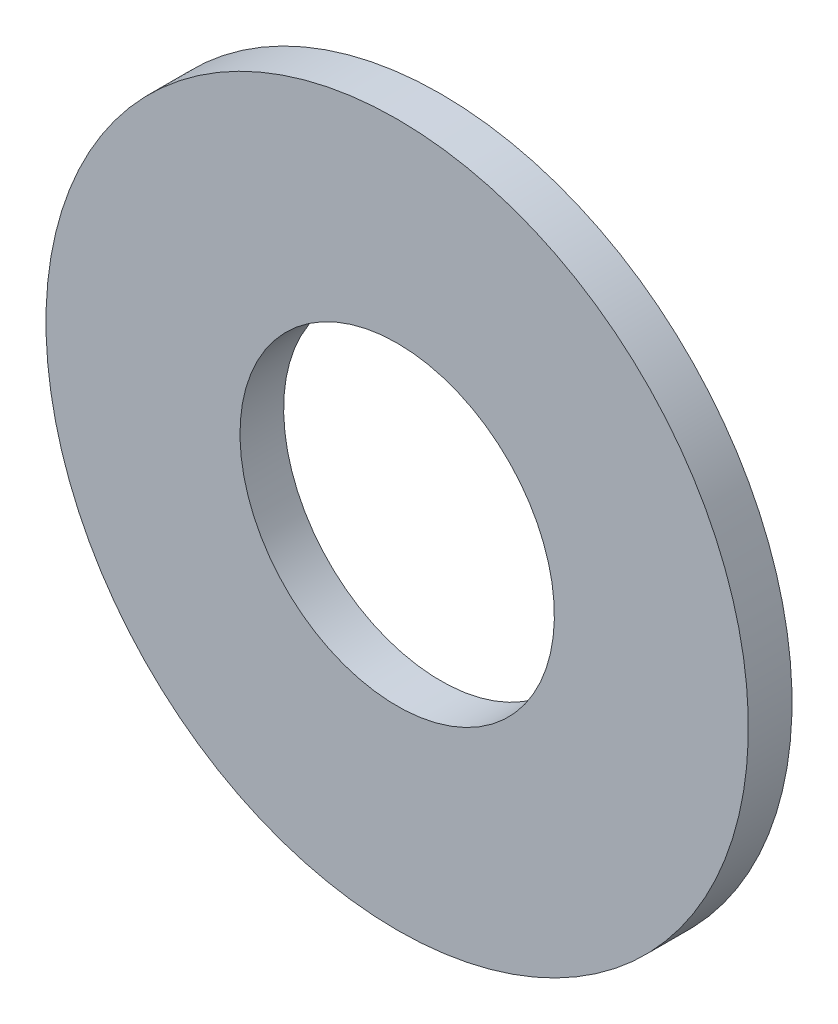
ISO-10303-21;
HEADER;
FILE_DESCRIPTION(('STEP AP214'),'2;1');
FILE_NAME('part.step','',(''),(''),'','','');
FILE_SCHEMA(('AUTOMOTIVE_DESIGN { 1 0 10303 214 1 1 1 1 }'));
ENDSEC;
DATA;
#1=APPLICATION_CONTEXT('core data for automotive mechanical design processes');
#2=APPLICATION_PROTOCOL_DEFINITION('international standard','automotive_design',2000,#1);
#3=PRODUCT_CONTEXT('',#1,'mechanical');
#4=PRODUCT('Part','Part','',(#3));
#5=PRODUCT_RELATED_PRODUCT_CATEGORY('part','',(#4));
#6=PRODUCT_DEFINITION_FORMATION('','',#4);
#7=PRODUCT_DEFINITION_CONTEXT('part definition',#1,'design');
#8=PRODUCT_DEFINITION('design','',#6,#7);
#9=PRODUCT_DEFINITION_SHAPE('','',#8);
#10=(LENGTH_UNIT() NAMED_UNIT(*) SI_UNIT(.MILLI.,.METRE.));
#11=(NAMED_UNIT(*) PLANE_ANGLE_UNIT() SI_UNIT($,.RADIAN.));
#12=(NAMED_UNIT(*) SI_UNIT($,.STERADIAN.) SOLID_ANGLE_UNIT());
#13=UNCERTAINTY_MEASURE_WITH_UNIT(LENGTH_MEASURE(1.E-05),#10,'distance_accuracy_value','');
#14=(GEOMETRIC_REPRESENTATION_CONTEXT(3) GLOBAL_UNCERTAINTY_ASSIGNED_CONTEXT((#13)) GLOBAL_UNIT_ASSIGNED_CONTEXT((#10,
#11,#12)) REPRESENTATION_CONTEXT('',''));
#15=CARTESIAN_POINT('',(0.,0.,0.));
#16=DIRECTION('',(0.,0.,1.));
#17=DIRECTION('',(1.,0.,0.));
#18=AXIS2_PLACEMENT_3D('',#15,#16,#17);
#19=CARTESIAN_POINT('',(0.,7.1501,0.888999999999995));
#20=DIRECTION('',(0.,0.,1.));
#21=DIRECTION('',(0.,-1.,0.));
#22=AXIS2_PLACEMENT_3D('',#19,#20,#21);
#23=PLANE('',#22);
#24=CARTESIAN_POINT('',(0.,0.,0.888999999999994));
#25=DIRECTION('',(0.,0.,-1.));
#26=DIRECTION('',(0.,1.,0.));
#27=AXIS2_PLACEMENT_3D('',#24,#25,#26);
#28=CIRCLE('',#27,3.2004);
#29=CARTESIAN_POINT('',(0.,3.2004,0.888999999999994));
#30=VERTEX_POINT('',#29);
#31=EDGE_CURVE('E10',#30,#30,#28,.T.);
#32=ORIENTED_EDGE('',*,*,#31,.T.);
#33=EDGE_LOOP('',(#32));
#34=FACE_BOUND('',#33,.T.);
#35=CARTESIAN_POINT('',(0.,0.,0.888999999999995));
#36=DIRECTION('',(0.,0.,-1.));
#37=DIRECTION('',(0.,1.,0.));
#38=AXIS2_PLACEMENT_3D('',#35,#36,#37);
#39=CIRCLE('',#38,7.1501);
#40=CARTESIAN_POINT('',(0.,7.1501,0.888999999999996));
#41=VERTEX_POINT('',#40);
#42=EDGE_CURVE('E46',#41,#41,#39,.T.);
#43=ORIENTED_EDGE('',*,*,#42,.F.);
#44=EDGE_LOOP('',(#43));
#45=FACE_BOUND('',#44,.T.);
#46=ADVANCED_FACE('F32',(#34,#45),#23,.T.);
#47=CARTESIAN_POINT('',(0.,0.,0.888999999999999));
#48=DIRECTION('',(0.,0.,-1.));
#49=DIRECTION('',(0.,1.,0.));
#50=AXIS2_PLACEMENT_3D('',#47,#48,#49);
#51=CYLINDRICAL_SURFACE('',#50,3.2004);
#52=CARTESIAN_POINT('',(0.,0.,0.));
#53=DIRECTION('',(0.,0.,-1.));
#54=DIRECTION('',(0.,1.,0.));
#55=AXIS2_PLACEMENT_3D('',#52,#53,#54);
#56=CIRCLE('',#55,3.2004);
#57=CARTESIAN_POINT('',(0.,3.2004,0.));
#58=VERTEX_POINT('',#57);
#59=EDGE_CURVE('E38',#58,#58,#56,.T.);
#60=ORIENTED_EDGE('',*,*,#59,.T.);
#61=EDGE_LOOP('',(#60));
#62=FACE_BOUND('',#61,.T.);
#63=ORIENTED_EDGE('',*,*,#31,.F.);
#64=EDGE_LOOP('',(#63));
#65=FACE_BOUND('',#64,.T.);
#66=ADVANCED_FACE('F56',(#62,#65),#51,.F.);
#67=CARTESIAN_POINT('',(0.,7.1501,0.));
#68=DIRECTION('',(0.,0.,-1.));
#69=DIRECTION('',(0.,1.,0.));
#70=AXIS2_PLACEMENT_3D('',#67,#68,#69);
#71=PLANE('',#70);
#72=CARTESIAN_POINT('',(0.,0.,0.));
#73=DIRECTION('',(0.,0.,-1.));
#74=DIRECTION('',(0.,1.,0.));
#75=AXIS2_PLACEMENT_3D('',#72,#73,#74);
#76=CIRCLE('',#75,7.1501);
#77=CARTESIAN_POINT('',(0.,7.1501,0.));
#78=VERTEX_POINT('',#77);
#79=EDGE_CURVE('E42',#78,#78,#76,.T.);
#80=ORIENTED_EDGE('',*,*,#79,.T.);
#81=EDGE_LOOP('',(#80));
#82=FACE_BOUND('',#81,.T.);
#83=ORIENTED_EDGE('',*,*,#59,.F.);
#84=EDGE_LOOP('',(#83));
#85=FACE_BOUND('',#84,.T.);
#86=ADVANCED_FACE('F60',(#82,#85),#71,.T.);
#87=CARTESIAN_POINT('',(0.,0.,0.888999999999999));
#88=DIRECTION('',(0.,0.,-1.));
#89=DIRECTION('',(0.,1.,0.));
#90=AXIS2_PLACEMENT_3D('',#87,#88,#89);
#91=CYLINDRICAL_SURFACE('',#90,7.1501);
#92=ORIENTED_EDGE('',*,*,#42,.T.);
#93=EDGE_LOOP('',(#92));
#94=FACE_BOUND('',#93,.T.);
#95=ORIENTED_EDGE('',*,*,#79,.F.);
#96=EDGE_LOOP('',(#95));
#97=FACE_BOUND('',#96,.T.);
#98=ADVANCED_FACE('F52',(#94,#97),#91,.T.);
#99=CLOSED_SHELL('',(#46,#66,#86,#98));
#100=MANIFOLD_SOLID_BREP('B2',#99);
#101=ADVANCED_BREP_SHAPE_REPRESENTATION('',(#18,#100),#14);
#102=SHAPE_DEFINITION_REPRESENTATION(#9,#101);
ENDSEC;
END-ISO-10303-21;
